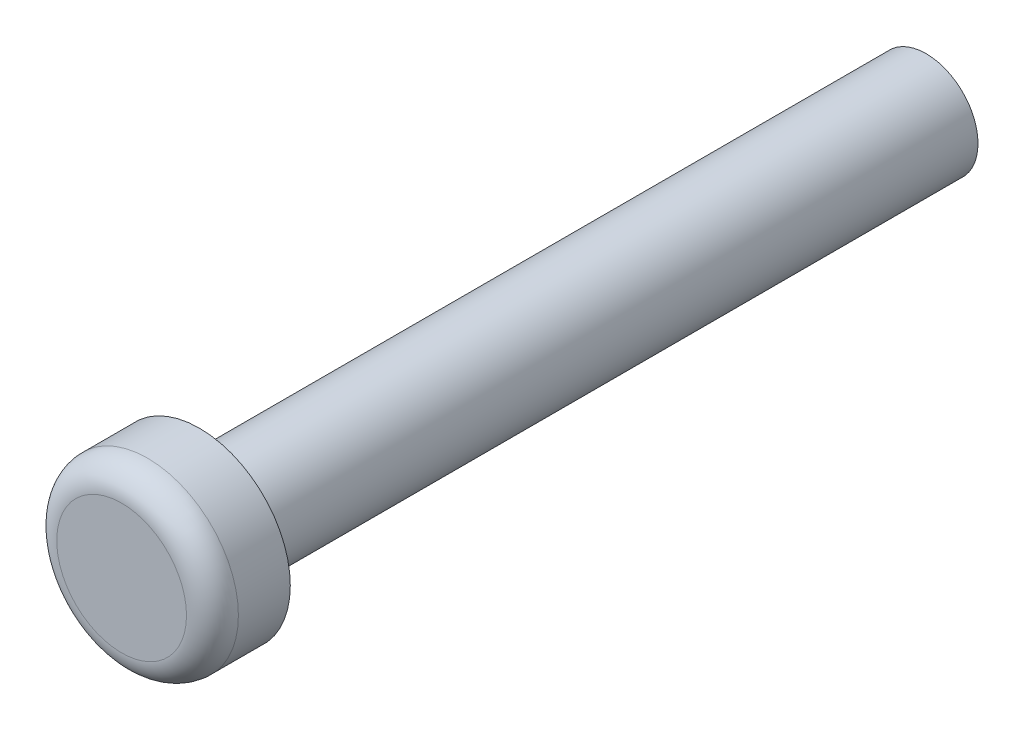
ISO-10303-21;
HEADER;
FILE_DESCRIPTION(('STEP AP214'),'2;1');
FILE_NAME('part.step','',(''),(''),'','','');
FILE_SCHEMA(('AUTOMOTIVE_DESIGN { 1 0 10303 214 1 1 1 1 }'));
ENDSEC;
DATA;
#1=APPLICATION_CONTEXT('core data for automotive mechanical design processes');
#2=APPLICATION_PROTOCOL_DEFINITION('international standard','automotive_design',2000,#1);
#3=PRODUCT_CONTEXT('',#1,'mechanical');
#4=PRODUCT('Part','Part','',(#3));
#5=PRODUCT_RELATED_PRODUCT_CATEGORY('part','',(#4));
#6=PRODUCT_DEFINITION_FORMATION('','',#4);
#7=PRODUCT_DEFINITION_CONTEXT('part definition',#1,'design');
#8=PRODUCT_DEFINITION('design','',#6,#7);
#9=PRODUCT_DEFINITION_SHAPE('','',#8);
#10=(LENGTH_UNIT() NAMED_UNIT(*) SI_UNIT(.MILLI.,.METRE.));
#11=(NAMED_UNIT(*) PLANE_ANGLE_UNIT() SI_UNIT($,.RADIAN.));
#12=(NAMED_UNIT(*) SI_UNIT($,.STERADIAN.) SOLID_ANGLE_UNIT());
#13=UNCERTAINTY_MEASURE_WITH_UNIT(LENGTH_MEASURE(1.E-05),#10,'distance_accuracy_value','');
#14=(GEOMETRIC_REPRESENTATION_CONTEXT(3) GLOBAL_UNCERTAINTY_ASSIGNED_CONTEXT((#13)) GLOBAL_UNIT_ASSIGNED_CONTEXT((#10,
#11,#12)) REPRESENTATION_CONTEXT('',''));
#15=CARTESIAN_POINT('',(0.,0.,0.));
#16=DIRECTION('',(0.,0.,1.));
#17=DIRECTION('',(1.,0.,0.));
#18=AXIS2_PLACEMENT_3D('',#15,#16,#17);
#19=CARTESIAN_POINT('',(0.,0.,0.));
#20=DIRECTION('',(0.,0.,1.));
#21=DIRECTION('',(1.,0.,0.));
#22=AXIS2_PLACEMENT_3D('',#19,#20,#21);
#23=PLANE('',#22);
#24=CARTESIAN_POINT('',(0.,0.,0.));
#25=DIRECTION('',(0.,0.,1.));
#26=DIRECTION('',(1.,0.,0.));
#27=AXIS2_PLACEMENT_3D('',#24,#25,#26);
#28=CIRCLE('',#27,4.445);
#29=CARTESIAN_POINT('',(-4.445,0.,0.));
#30=VERTEX_POINT('',#29);
#31=EDGE_CURVE('E49',#30,#30,#28,.T.);
#32=ORIENTED_EDGE('',*,*,#31,.F.);
#33=EDGE_LOOP('',(#32));
#34=FACE_BOUND('',#33,.T.);
#35=CARTESIAN_POINT('',(0.,0.,0.));
#36=DIRECTION('',(0.,0.,1.));
#37=DIRECTION('',(1.,0.,0.));
#38=AXIS2_PLACEMENT_3D('',#35,#36,#37);
#39=CIRCLE('',#38,2.54);
#40=CARTESIAN_POINT('',(2.54,0.,0.));
#41=VERTEX_POINT('',#40);
#42=EDGE_CURVE('E10',#41,#41,#39,.F.);
#43=ORIENTED_EDGE('',*,*,#42,.F.);
#44=EDGE_LOOP('',(#43));
#45=FACE_BOUND('',#44,.T.);
#46=ADVANCED_FACE('F34',(#34,#45),#23,.F.);
#47=CARTESIAN_POINT('',(0.,0.,3.81));
#48=DIRECTION('',(0.,0.,-1.));
#49=DIRECTION('',(-1.,0.,0.));
#50=AXIS2_PLACEMENT_3D('',#47,#48,#49);
#51=CYLINDRICAL_SURFACE('',#50,4.445);
#52=CARTESIAN_POINT('',(0.,0.,2.54));
#53=DIRECTION('',(0.,0.,1.));
#54=DIRECTION('',(1.,0.,0.));
#55=AXIS2_PLACEMENT_3D('',#52,#53,#54);
#56=CIRCLE('',#55,4.445);
#57=CARTESIAN_POINT('',(-4.445,0.,2.54));
#58=VERTEX_POINT('',#57);
#59=EDGE_CURVE('E41',#58,#58,#56,.F.);
#60=CARTESIAN_POINT('',(-4.445,0.,2.54));
#61=CARTESIAN_POINT('',(-4.445,0.,2.51354166666667));
#62=CARTESIAN_POINT('',(-4.445,0.,2.48708333333333));
#63=CARTESIAN_POINT('',(-4.445,0.,2.43416666666667));
#64=CARTESIAN_POINT('',(-4.445,0.,2.40770833333333));
#65=CARTESIAN_POINT('',(-4.445,0.,2.35479166666667));
#66=CARTESIAN_POINT('',(-4.445,0.,2.32833333333333));
#67=CARTESIAN_POINT('',(-4.445,0.,2.27541666666667));
#68=CARTESIAN_POINT('',(-4.445,0.,2.24895833333333));
#69=CARTESIAN_POINT('',(-4.445,0.,2.19604166666667));
#70=CARTESIAN_POINT('',(-4.445,0.,2.16958333333333));
#71=CARTESIAN_POINT('',(-4.445,0.,2.11666666666667));
#72=CARTESIAN_POINT('',(-4.445,0.,2.09020833333333));
#73=CARTESIAN_POINT('',(-4.445,0.,2.03729166666667));
#74=CARTESIAN_POINT('',(-4.445,0.,2.01083333333333));
#75=CARTESIAN_POINT('',(-4.445,0.,1.95791666666667));
#76=CARTESIAN_POINT('',(-4.445,0.,1.93145833333333));
#77=CARTESIAN_POINT('',(-4.445,0.,1.87854166666667));
#78=CARTESIAN_POINT('',(-4.445,0.,1.85208333333333));
#79=CARTESIAN_POINT('',(-4.445,0.,1.79916666666667));
#80=CARTESIAN_POINT('',(-4.445,0.,1.77270833333333));
#81=CARTESIAN_POINT('',(-4.445,0.,1.71979166666667));
#82=CARTESIAN_POINT('',(-4.445,0.,1.69333333333333));
#83=CARTESIAN_POINT('',(-4.445,0.,1.64041666666667));
#84=CARTESIAN_POINT('',(-4.445,0.,1.61395833333333));
#85=CARTESIAN_POINT('',(-4.445,0.,1.56104166666667));
#86=CARTESIAN_POINT('',(-4.445,0.,1.53458333333333));
#87=CARTESIAN_POINT('',(-4.445,0.,1.48166666666667));
#88=CARTESIAN_POINT('',(-4.445,0.,1.45520833333333));
#89=CARTESIAN_POINT('',(-4.445,0.,1.40229166666667));
#90=CARTESIAN_POINT('',(-4.445,0.,1.37583333333333));
#91=CARTESIAN_POINT('',(-4.445,0.,1.32291666666667));
#92=CARTESIAN_POINT('',(-4.445,0.,1.29645833333333));
#93=CARTESIAN_POINT('',(-4.445,0.,1.24354166666667));
#94=CARTESIAN_POINT('',(-4.445,0.,1.21708333333333));
#95=CARTESIAN_POINT('',(-4.445,0.,1.16416666666667));
#96=CARTESIAN_POINT('',(-4.445,0.,1.13770833333333));
#97=CARTESIAN_POINT('',(-4.445,0.,1.08479166666667));
#98=CARTESIAN_POINT('',(-4.445,0.,1.05833333333333));
#99=CARTESIAN_POINT('',(-4.445,0.,1.00541666666667));
#100=CARTESIAN_POINT('',(-4.445,0.,0.978958333333333));
#101=CARTESIAN_POINT('',(-4.445,0.,0.926041666666666));
#102=CARTESIAN_POINT('',(-4.445,0.,0.899583333333333));
#103=CARTESIAN_POINT('',(-4.445,0.,0.846666666666667));
#104=CARTESIAN_POINT('',(-4.445,0.,0.820208333333333));
#105=CARTESIAN_POINT('',(-4.445,0.,0.767291666666667));
#106=CARTESIAN_POINT('',(-4.445,0.,0.740833333333333));
#107=CARTESIAN_POINT('',(-4.445,0.,0.687916666666667));
#108=CARTESIAN_POINT('',(-4.445,0.,0.661458333333333));
#109=CARTESIAN_POINT('',(-4.445,0.,0.608541666666667));
#110=CARTESIAN_POINT('',(-4.445,0.,0.582083333333333));
#111=CARTESIAN_POINT('',(-4.445,0.,0.529166666666667));
#112=CARTESIAN_POINT('',(-4.445,0.,0.502708333333333));
#113=CARTESIAN_POINT('',(-4.445,0.,0.449791666666667));
#114=CARTESIAN_POINT('',(-4.445,0.,0.423333333333333));
#115=CARTESIAN_POINT('',(-4.445,0.,0.370416666666667));
#116=CARTESIAN_POINT('',(-4.445,0.,0.343958333333333));
#117=CARTESIAN_POINT('',(-4.445,0.,0.291041666666667));
#118=CARTESIAN_POINT('',(-4.445,0.,0.264583333333333));
#119=CARTESIAN_POINT('',(-4.445,0.,0.211666666666667));
#120=CARTESIAN_POINT('',(-4.445,0.,0.185208333333333));
#121=CARTESIAN_POINT('',(-4.445,0.,0.132291666666667));
#122=CARTESIAN_POINT('',(-4.445,0.,0.105833333333333));
#123=CARTESIAN_POINT('',(-4.445,0.,0.0529166666666667));
#124=CARTESIAN_POINT('',(-4.445,0.,0.0264583333333333));
#125=CARTESIAN_POINT('',(-4.445,0.,0.));
#126=B_SPLINE_CURVE_WITH_KNOTS('',3,(#60,#61,#62,#63,#64,#65,#66,#67,#68,#69,#70,#71,#72,#73,
#74,#75,#76,#77,#78,#79,#80,#81,#82,#83,#84,#85,#86,#87,#88,#89,#90,#91,#92,#93,#94,#95,#96,#97,
#98,#99,#100,#101,#102,#103,#104,#105,#106,#107,#108,#109,#110,#111,#112,#113,#114,#115,#116,
#117,#118,#119,#120,#121,#122,#123,#124,#125),.UNSPECIFIED.,.F.,.F.,(4,2,2,2,2,2,2,2,2,2,2,2,2,
2,2,2,2,2,2,2,2,2,2,2,2,2,2,2,2,2,2,2,4),(0.,0.0793750000000004,0.15875,0.238125,0.3175,
0.396875000000001,0.47625,0.555625,0.635,0.714375,0.79375,0.873125,0.9525,1.031875,1.11125,
1.190625,1.27,1.349375,1.42875,1.508125,1.5875,1.666875,1.74625,1.825625,1.905,1.984375,2.06375,
2.143125,2.2225,2.301875,2.38125,2.460625,2.54),.UNSPECIFIED.);
#127=EDGE_CURVE('BSEAM72',#58,#30,#126,.T.);
#128=ORIENTED_EDGE('',*,*,#59,.T.);
#129=ORIENTED_EDGE('',*,*,#31,.T.);
#130=ORIENTED_EDGE('',*,*,#127,.T.);
#131=ORIENTED_EDGE('',*,*,#127,.F.);
#132=EDGE_LOOP('',(#128,#130,#129,#131));
#133=FACE_BOUND('',#132,.T.);
#134=ADVANCED_FACE('F72',(#133),#51,.T.);
#135=CARTESIAN_POINT('',(0.,0.,3.81));
#136=DIRECTION('',(0.,0.,1.));
#137=DIRECTION('',(1.,0.,0.));
#138=AXIS2_PLACEMENT_3D('',#135,#136,#137);
#139=PLANE('',#138);
#140=CARTESIAN_POINT('',(0.,0.,3.81));
#141=DIRECTION('',(0.,0.,1.));
#142=DIRECTION('',(1.,0.,0.));
#143=AXIS2_PLACEMENT_3D('',#140,#141,#142);
#144=CIRCLE('',#143,3.175);
#145=CARTESIAN_POINT('',(3.175,0.,3.81));
#146=VERTEX_POINT('',#145);
#147=EDGE_CURVE('E45',#146,#146,#144,.T.);
#148=ORIENTED_EDGE('',*,*,#147,.T.);
#149=EDGE_LOOP('',(#148));
#150=FACE_BOUND('',#149,.T.);
#151=ADVANCED_FACE('F68',(#150),#139,.T.);
#152=CARTESIAN_POINT('',(0.,0.,2.54));
#153=DIRECTION('',(0.,0.,1.));
#154=DIRECTION('',(1.,0.,0.));
#155=AXIS2_PLACEMENT_3D('',#152,#153,#154);
#156=TOROIDAL_SURFACE('',#155,3.175,1.27);
#157=ORIENTED_EDGE('',*,*,#59,.F.);
#158=EDGE_LOOP('',(#157));
#159=FACE_BOUND('',#158,.T.);
#160=ORIENTED_EDGE('',*,*,#147,.F.);
#161=EDGE_LOOP('',(#160));
#162=FACE_BOUND('',#161,.T.);
#163=ADVANCED_FACE('F36',(#159,#162),#156,.T.);
#164=CARTESIAN_POINT('',(0.,0.,-35.56));
#165=DIRECTION('',(0.,0.,1.));
#166=DIRECTION('',(1.,0.,0.));
#167=AXIS2_PLACEMENT_3D('',#164,#165,#166);
#168=CYLINDRICAL_SURFACE('',#167,2.54);
#169=CARTESIAN_POINT('',(0.,0.,-35.56));
#170=DIRECTION('',(0.,0.,-1.));
#171=DIRECTION('',(-1.,0.,0.));
#172=AXIS2_PLACEMENT_3D('',#169,#170,#171);
#173=CIRCLE('',#172,2.54);
#174=CARTESIAN_POINT('',(-2.54,0.,-35.56));
#175=VERTEX_POINT('',#174);
#176=EDGE_CURVE('E54',#175,#175,#173,.T.);
#177=ORIENTED_EDGE('',*,*,#176,.F.);
#178=EDGE_LOOP('',(#177));
#179=FACE_BOUND('',#178,.T.);
#180=ORIENTED_EDGE('',*,*,#42,.T.);
#181=EDGE_LOOP('',(#180));
#182=FACE_BOUND('',#181,.T.);
#183=ADVANCED_FACE('F60',(#179,#182),#168,.T.);
#184=CARTESIAN_POINT('',(0.,0.,-35.56));
#185=DIRECTION('',(0.,0.,-1.));
#186=DIRECTION('',(-1.,0.,0.));
#187=AXIS2_PLACEMENT_3D('',#184,#185,#186);
#188=PLANE('',#187);
#189=ORIENTED_EDGE('',*,*,#176,.T.);
#190=EDGE_LOOP('',(#189));
#191=FACE_BOUND('',#190,.T.);
#192=ADVANCED_FACE('F58',(#191),#188,.T.);
#193=CLOSED_SHELL('',(#46,#134,#151,#163,#183,#192));
#194=MANIFOLD_SOLID_BREP('B2',#193);
#195=ADVANCED_BREP_SHAPE_REPRESENTATION('',(#18,#194),#14);
#196=SHAPE_DEFINITION_REPRESENTATION(#9,#195);
ENDSEC;
END-ISO-10303-21;
